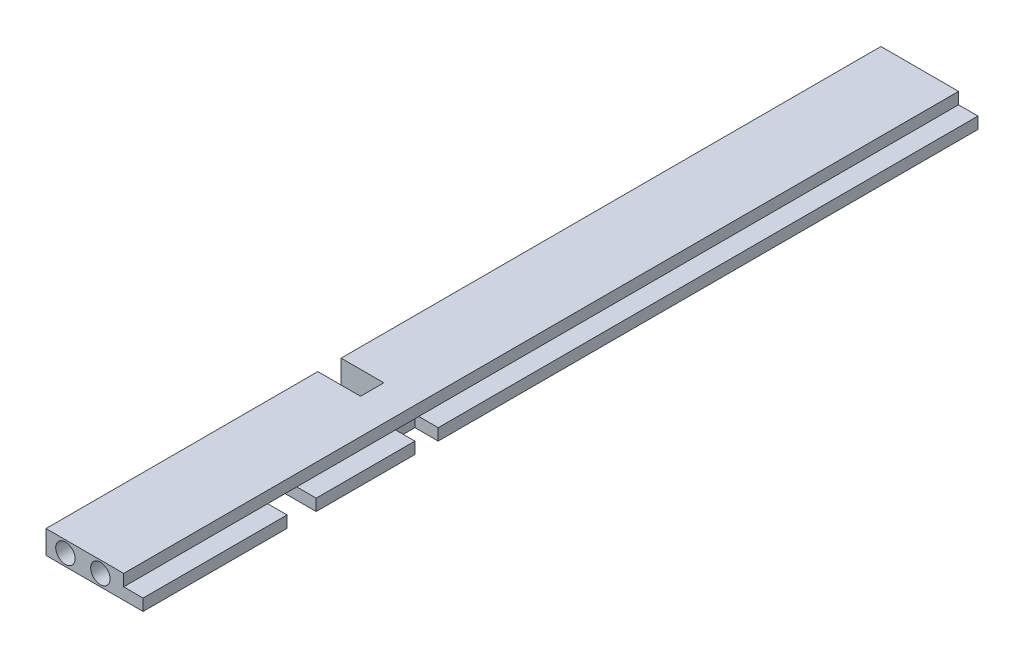
ISO-10303-21;
HEADER;
FILE_DESCRIPTION(('STEP AP214'),'2;1');
FILE_NAME('part.step','',(''),(''),'','','');
FILE_SCHEMA(('AUTOMOTIVE_DESIGN { 1 0 10303 214 1 1 1 1 }'));
ENDSEC;
DATA;
#1=APPLICATION_CONTEXT('core data for automotive mechanical design processes');
#2=APPLICATION_PROTOCOL_DEFINITION('international standard','automotive_design',2000,#1);
#3=PRODUCT_CONTEXT('',#1,'mechanical');
#4=PRODUCT('Part','Part','',(#3));
#5=PRODUCT_RELATED_PRODUCT_CATEGORY('part','',(#4));
#6=PRODUCT_DEFINITION_FORMATION('','',#4);
#7=PRODUCT_DEFINITION_CONTEXT('part definition',#1,'design');
#8=PRODUCT_DEFINITION('design','',#6,#7);
#9=PRODUCT_DEFINITION_SHAPE('','',#8);
#10=(LENGTH_UNIT() NAMED_UNIT(*) SI_UNIT(.MILLI.,.METRE.));
#11=(NAMED_UNIT(*) PLANE_ANGLE_UNIT() SI_UNIT($,.RADIAN.));
#12=(NAMED_UNIT(*) SI_UNIT($,.STERADIAN.) SOLID_ANGLE_UNIT());
#13=UNCERTAINTY_MEASURE_WITH_UNIT(LENGTH_MEASURE(1.E-05),#10,'distance_accuracy_value','');
#14=(GEOMETRIC_REPRESENTATION_CONTEXT(3) GLOBAL_UNCERTAINTY_ASSIGNED_CONTEXT((#13)) GLOBAL_UNIT_ASSIGNED_CONTEXT((#10,
#11,#12)) REPRESENTATION_CONTEXT('',''));
#15=CARTESIAN_POINT('',(0.,0.,0.));
#16=DIRECTION('',(0.,0.,1.));
#17=DIRECTION('',(1.,0.,0.));
#18=AXIS2_PLACEMENT_3D('',#15,#16,#17);
#19=CARTESIAN_POINT('',(25.,3.,215.));
#20=DIRECTION('',(-1.,0.,0.));
#21=DIRECTION('',(0.,0.,1.));
#22=AXIS2_PLACEMENT_3D('',#19,#20,#21);
#23=PLANE('',#22);
#24=DIRECTION('',(0.,0.,-1.));
#25=VECTOR('',#24,1.);
#26=CARTESIAN_POINT('',(25.,3.,215.));
#27=LINE('',#26,#25);
#28=CARTESIAN_POINT('',(25.,3.,139.));
#29=VERTEX_POINT('',#28);
#30=CARTESIAN_POINT('',(25.,3.,0.));
#31=VERTEX_POINT('',#30);
#32=EDGE_CURVE('E227',#29,#31,#27,.T.);
#33=ORIENTED_EDGE('',*,*,#32,.F.);
#34=DIRECTION('',(0.,-1.,0.));
#35=VECTOR('',#34,1.);
#36=CARTESIAN_POINT('',(25.,3.,139.));
#37=LINE('',#36,#35);
#38=CARTESIAN_POINT('',(25.,0.,139.));
#39=VERTEX_POINT('',#38);
#40=EDGE_CURVE('E348',#29,#39,#37,.T.);
#41=ORIENTED_EDGE('',*,*,#40,.T.);
#42=DIRECTION('',(0.,0.,-1.));
#43=VECTOR('',#42,1.);
#44=CARTESIAN_POINT('',(25.,0.,215.));
#45=LINE('',#44,#43);
#46=CARTESIAN_POINT('',(25.,0.,0.));
#47=VERTEX_POINT('',#46);
#48=EDGE_CURVE('E45',#39,#47,#45,.T.);
#49=ORIENTED_EDGE('',*,*,#48,.T.);
#50=DIRECTION('',(0.,1.,0.));
#51=VECTOR('',#50,1.);
#52=CARTESIAN_POINT('',(25.,3.,0.));
#53=LINE('',#52,#51);
#54=EDGE_CURVE('E259',#47,#31,#53,.T.);
#55=ORIENTED_EDGE('',*,*,#54,.T.);
#56=EDGE_LOOP('',(#33,#41,#49,#55));
#57=FACE_BOUND('',#56,.T.);
#58=ADVANCED_FACE('F36',(#57),#23,.F.);
#59=CARTESIAN_POINT('',(20.,3.,215.));
#60=DIRECTION('',(0.,-1.,0.));
#61=DIRECTION('',(1.,0.,0.));
#62=AXIS2_PLACEMENT_3D('',#59,#60,#61);
#63=PLANE('',#62);
#64=DIRECTION('',(0.,0.,-1.));
#65=VECTOR('',#64,1.);
#66=CARTESIAN_POINT('',(20.,3.,215.));
#67=LINE('',#66,#65);
#68=CARTESIAN_POINT('',(20.,3.,139.));
#69=VERTEX_POINT('',#68);
#70=CARTESIAN_POINT('',(20.,3.,0.));
#71=VERTEX_POINT('',#70);
#72=EDGE_CURVE('E234',#69,#71,#67,.T.);
#73=ORIENTED_EDGE('',*,*,#72,.F.);
#74=DIRECTION('',(1.,0.,0.));
#75=VECTOR('',#74,1.);
#76=CARTESIAN_POINT('',(25.,3.,139.));
#77=LINE('',#76,#75);
#78=EDGE_CURVE('E369',#69,#29,#77,.T.);
#79=ORIENTED_EDGE('',*,*,#78,.T.);
#80=ORIENTED_EDGE('',*,*,#32,.T.);
#81=DIRECTION('',(-1.,0.,0.));
#82=VECTOR('',#81,1.);
#83=CARTESIAN_POINT('',(20.,3.,0.));
#84=LINE('',#83,#82);
#85=EDGE_CURVE('E256',#31,#71,#84,.T.);
#86=ORIENTED_EDGE('',*,*,#85,.T.);
#87=EDGE_LOOP('',(#73,#79,#80,#86));
#88=FACE_BOUND('',#87,.T.);
#89=ADVANCED_FACE('F484',(#88),#63,.F.);
#90=CARTESIAN_POINT('',(0.,0.,215.));
#91=DIRECTION('',(1.,0.,0.));
#92=DIRECTION('',(0.,0.,-1.));
#93=AXIS2_PLACEMENT_3D('',#90,#91,#92);
#94=PLANE('',#93);
#95=DIRECTION('',(0.,0.,-1.));
#96=VECTOR('',#95,1.);
#97=CARTESIAN_POINT('',(0.,6.,215.));
#98=LINE('',#97,#96);
#99=CARTESIAN_POINT('',(0.,6.,215.));
#100=VERTEX_POINT('',#99);
#101=CARTESIAN_POINT('',(0.,6.,145.));
#102=VERTEX_POINT('',#101);
#103=EDGE_CURVE('E238',#100,#102,#98,.T.);
#104=ORIENTED_EDGE('',*,*,#103,.T.);
#105=DIRECTION('',(0.,-1.,0.));
#106=VECTOR('',#105,1.);
#107=CARTESIAN_POINT('',(0.,6.,145.));
#108=LINE('',#107,#106);
#109=CARTESIAN_POINT('',(0.,0.,145.));
#110=VERTEX_POINT('',#109);
#111=EDGE_CURVE('E321',#102,#110,#108,.T.);
#112=ORIENTED_EDGE('',*,*,#111,.T.);
#113=DIRECTION('',(0.,0.,-1.));
#114=VECTOR('',#113,1.);
#115=CARTESIAN_POINT('',(0.,0.,215.));
#116=LINE('',#115,#114);
#117=CARTESIAN_POINT('',(0.,0.,170.424574214991));
#118=VERTEX_POINT('',#117);
#119=EDGE_CURVE('E245',#118,#110,#116,.T.);
#120=ORIENTED_EDGE('',*,*,#119,.F.);
#121=DIRECTION('',(0.,-1.,0.));
#122=VECTOR('',#121,1.);
#123=CARTESIAN_POINT('',(0.,3.,170.424574214991));
#124=LINE('',#123,#122);
#125=CARTESIAN_POINT('',(0.,3.,170.424574214991));
#126=VERTEX_POINT('',#125);
#127=EDGE_CURVE('E303',#126,#118,#124,.T.);
#128=ORIENTED_EDGE('',*,*,#127,.F.);
#129=DIRECTION('',(0.,0.,-1.));
#130=VECTOR('',#129,1.);
#131=CARTESIAN_POINT('',(0.,3.,170.424574214991));
#132=LINE('',#131,#130);
#133=CARTESIAN_POINT('',(0.,3.,177.924574214991));
#134=VERTEX_POINT('',#133);
#135=EDGE_CURVE('E314',#134,#126,#132,.T.);
#136=ORIENTED_EDGE('',*,*,#135,.F.);
#137=DIRECTION('',(0.,-1.,0.));
#138=VECTOR('',#137,1.);
#139=CARTESIAN_POINT('',(0.,3.,177.924574214991));
#140=LINE('',#139,#138);
#141=CARTESIAN_POINT('',(0.,0.,177.924574214991));
#142=VERTEX_POINT('',#141);
#143=EDGE_CURVE('E295',#134,#142,#140,.T.);
#144=ORIENTED_EDGE('',*,*,#143,.T.);
#145=CARTESIAN_POINT('',(0.,0.,215.));
#146=VERTEX_POINT('',#145);
#147=EDGE_CURVE('E242',#146,#142,#116,.T.);
#148=ORIENTED_EDGE('',*,*,#147,.F.);
#149=DIRECTION('',(0.,-1.,0.));
#150=VECTOR('',#149,1.);
#151=CARTESIAN_POINT('',(0.,0.,215.));
#152=LINE('',#151,#150);
#153=EDGE_CURVE('E266',#100,#146,#152,.T.);
#154=ORIENTED_EDGE('',*,*,#153,.F.);
#155=EDGE_LOOP('',(#104,#112,#120,#128,#136,#144,#148,#154));
#156=FACE_BOUND('',#155,.T.);
#157=ADVANCED_FACE('F428',(#156),#94,.F.);
#158=CARTESIAN_POINT('',(25.,0.,170.424574214991));
#159=VERTEX_POINT('',#158);
#160=CARTESIAN_POINT('',(25.,0.,145.));
#161=VERTEX_POINT('',#160);
#162=EDGE_CURVE('E44',#159,#161,#45,.T.);
#163=ORIENTED_EDGE('',*,*,#162,.T.);
#164=DIRECTION('',(0.,-1.,0.));
#165=VECTOR('',#164,1.);
#166=CARTESIAN_POINT('',(25.,3.,145.));
#167=LINE('',#166,#165);
#168=CARTESIAN_POINT('',(25.,3.,145.));
#169=VERTEX_POINT('',#168);
#170=EDGE_CURVE('E203',#169,#161,#167,.T.);
#171=ORIENTED_EDGE('',*,*,#170,.F.);
#172=CARTESIAN_POINT('',(25.,3.,170.424574214991));
#173=VERTEX_POINT('',#172);
#174=EDGE_CURVE('E218',#173,#169,#27,.T.);
#175=ORIENTED_EDGE('',*,*,#174,.F.);
#176=DIRECTION('',(0.,-1.,0.));
#177=VECTOR('',#176,1.);
#178=CARTESIAN_POINT('',(25.,3.,170.424574214991));
#179=LINE('',#178,#177);
#180=EDGE_CURVE('E265',#173,#159,#179,.T.);
#181=ORIENTED_EDGE('',*,*,#180,.T.);
#182=EDGE_LOOP('',(#163,#171,#175,#181));
#183=FACE_BOUND('',#182,.T.);
#184=ADVANCED_FACE('F216',(#183),#23,.F.);
#185=ORIENTED_EDGE('',*,*,#174,.T.);
#186=DIRECTION('',(-1.,0.,0.));
#187=VECTOR('',#186,1.);
#188=CARTESIAN_POINT('',(25.,3.,145.));
#189=LINE('',#188,#187);
#190=CARTESIAN_POINT('',(20.,3.,145.));
#191=VERTEX_POINT('',#190);
#192=EDGE_CURVE('E199',#169,#191,#189,.T.);
#193=ORIENTED_EDGE('',*,*,#192,.T.);
#194=CARTESIAN_POINT('',(20.,3.,170.424574214991));
#195=VERTEX_POINT('',#194);
#196=EDGE_CURVE('E479',#195,#191,#67,.T.);
#197=ORIENTED_EDGE('',*,*,#196,.F.);
#198=DIRECTION('',(1.,0.,0.));
#199=VECTOR('',#198,1.);
#200=CARTESIAN_POINT('',(25.,3.,170.424574214991));
#201=LINE('',#200,#199);
#202=EDGE_CURVE('E225',#195,#173,#201,.T.);
#203=ORIENTED_EDGE('',*,*,#202,.T.);
#204=EDGE_LOOP('',(#185,#193,#197,#203));
#205=FACE_BOUND('',#204,.T.);
#206=ADVANCED_FACE('F223',(#205),#63,.F.);
#207=CARTESIAN_POINT('',(25.,0.,215.));
#208=DIRECTION('',(0.,1.,0.));
#209=DIRECTION('',(-1.,0.,0.));
#210=AXIS2_PLACEMENT_3D('',#207,#208,#209);
#211=PLANE('',#210);
#212=ORIENTED_EDGE('',*,*,#48,.F.);
#213=DIRECTION('',(1.,0.,0.));
#214=VECTOR('',#213,1.);
#215=CARTESIAN_POINT('',(25.,0.,139.));
#216=LINE('',#215,#214);
#217=CARTESIAN_POINT('',(19.,0.,139.));
#218=VERTEX_POINT('',#217);
#219=EDGE_CURVE('E360',#218,#39,#216,.T.);
#220=ORIENTED_EDGE('',*,*,#219,.F.);
#221=DIRECTION('',(0.,0.,-1.));
#222=VECTOR('',#221,1.);
#223=CARTESIAN_POINT('',(19.,0.,139.));
#224=LINE('',#223,#222);
#225=CARTESIAN_POINT('',(19.,0.,145.));
#226=VERTEX_POINT('',#225);
#227=EDGE_CURVE('E362',#226,#218,#224,.T.);
#228=ORIENTED_EDGE('',*,*,#227,.F.);
#229=DIRECTION('',(-1.,0.,0.));
#230=VECTOR('',#229,1.);
#231=CARTESIAN_POINT('',(25.,0.,145.));
#232=LINE('',#231,#230);
#233=EDGE_CURVE('E365',#161,#226,#232,.T.);
#234=ORIENTED_EDGE('',*,*,#233,.F.);
#235=ORIENTED_EDGE('',*,*,#162,.F.);
#236=DIRECTION('',(1.,0.,0.));
#237=VECTOR('',#236,1.);
#238=CARTESIAN_POINT('',(25.,0.,170.424574214991));
#239=LINE('',#238,#237);
#240=CARTESIAN_POINT('',(17.,0.,170.424574214991));
#241=VERTEX_POINT('',#240);
#242=EDGE_CURVE('E286',#241,#159,#239,.T.);
#243=ORIENTED_EDGE('',*,*,#242,.F.);
#244=DIRECTION('',(0.,0.,-1.));
#245=VECTOR('',#244,1.);
#246=CARTESIAN_POINT('',(17.,0.,170.424574214991));
#247=LINE('',#246,#245);
#248=CARTESIAN_POINT('',(17.,0.,177.924574214991));
#249=VERTEX_POINT('',#248);
#250=EDGE_CURVE('E289',#249,#241,#247,.T.);
#251=ORIENTED_EDGE('',*,*,#250,.F.);
#252=DIRECTION('',(-1.,0.,0.));
#253=VECTOR('',#252,1.);
#254=CARTESIAN_POINT('',(25.,0.,177.924574214991));
#255=LINE('',#254,#253);
#256=CARTESIAN_POINT('',(25.,0.,177.924574214991));
#257=VERTEX_POINT('',#256);
#258=EDGE_CURVE('E292',#257,#249,#255,.T.);
#259=ORIENTED_EDGE('',*,*,#258,.F.);
#260=CARTESIAN_POINT('',(25.,0.,215.));
#261=VERTEX_POINT('',#260);
#262=EDGE_CURVE('E11',#261,#257,#45,.T.);
#263=ORIENTED_EDGE('',*,*,#262,.F.);
#264=DIRECTION('',(1.,0.,0.));
#265=VECTOR('',#264,1.);
#266=CARTESIAN_POINT('',(25.,0.,215.));
#267=LINE('',#266,#265);
#268=EDGE_CURVE('E250',#146,#261,#267,.T.);
#269=ORIENTED_EDGE('',*,*,#268,.F.);
#270=ORIENTED_EDGE('',*,*,#147,.T.);
#271=DIRECTION('',(-1.,0.,0.));
#272=VECTOR('',#271,1.);
#273=CARTESIAN_POINT('',(0.,0.,177.924574214991));
#274=LINE('',#273,#272);
#275=CARTESIAN_POINT('',(11.,0.,177.924574214991));
#276=VERTEX_POINT('',#275);
#277=EDGE_CURVE('E312',#276,#142,#274,.T.);
#278=ORIENTED_EDGE('',*,*,#277,.F.);
#279=DIRECTION('',(0.,0.,1.));
#280=VECTOR('',#279,1.);
#281=CARTESIAN_POINT('',(11.,0.,170.424574214991));
#282=LINE('',#281,#280);
#283=CARTESIAN_POINT('',(11.,0.,170.424574214991));
#284=VERTEX_POINT('',#283);
#285=EDGE_CURVE('E315',#284,#276,#282,.T.);
#286=ORIENTED_EDGE('',*,*,#285,.F.);
#287=DIRECTION('',(1.,0.,0.));
#288=VECTOR('',#287,1.);
#289=CARTESIAN_POINT('',(0.,0.,170.424574214991));
#290=LINE('',#289,#288);
#291=EDGE_CURVE('E318',#118,#284,#290,.T.);
#292=ORIENTED_EDGE('',*,*,#291,.F.);
#293=ORIENTED_EDGE('',*,*,#119,.T.);
#294=DIRECTION('',(-1.,0.,0.));
#295=VECTOR('',#294,1.);
#296=CARTESIAN_POINT('',(0.,0.,145.));
#297=LINE('',#296,#295);
#298=CARTESIAN_POINT('',(11.,0.,145.));
#299=VERTEX_POINT('',#298);
#300=EDGE_CURVE('E340',#299,#110,#297,.T.);
#301=ORIENTED_EDGE('',*,*,#300,.F.);
#302=DIRECTION('',(0.,0.,1.));
#303=VECTOR('',#302,1.);
#304=CARTESIAN_POINT('',(11.,0.,139.));
#305=LINE('',#304,#303);
#306=CARTESIAN_POINT('',(11.,0.,139.));
#307=VERTEX_POINT('',#306);
#308=EDGE_CURVE('E342',#307,#299,#305,.T.);
#309=ORIENTED_EDGE('',*,*,#308,.F.);
#310=DIRECTION('',(1.,0.,0.));
#311=VECTOR('',#310,1.);
#312=CARTESIAN_POINT('',(0.,0.,139.));
#313=LINE('',#312,#311);
#314=CARTESIAN_POINT('',(0.,0.,139.));
#315=VERTEX_POINT('',#314);
#316=EDGE_CURVE('E345',#315,#307,#313,.T.);
#317=ORIENTED_EDGE('',*,*,#316,.F.);
#318=CARTESIAN_POINT('',(0.,0.,0.));
#319=VERTEX_POINT('',#318);
#320=EDGE_CURVE('E246',#315,#319,#116,.T.);
#321=ORIENTED_EDGE('',*,*,#320,.T.);
#322=DIRECTION('',(1.,0.,0.));
#323=VECTOR('',#322,1.);
#324=CARTESIAN_POINT('',(25.,0.,0.));
#325=LINE('',#324,#323);
#326=EDGE_CURVE('E262',#319,#47,#325,.T.);
#327=ORIENTED_EDGE('',*,*,#326,.T.);
#328=EDGE_LOOP('',(#212,#220,#228,#234,#235,#243,#251,#259,#263,#269,#270,#278,#286,#292,#293,
#301,#309,#317,#321,#327));
#329=FACE_BOUND('',#328,.T.);
#330=ADVANCED_FACE('F38',(#329),#211,.F.);
#331=ORIENTED_EDGE('',*,*,#262,.T.);
#332=DIRECTION('',(0.,-1.,0.));
#333=VECTOR('',#332,1.);
#334=CARTESIAN_POINT('',(25.,3.,177.924574214991));
#335=LINE('',#334,#333);
#336=CARTESIAN_POINT('',(25.,3.,177.924574214991));
#337=VERTEX_POINT('',#336);
#338=EDGE_CURVE('E278',#337,#257,#335,.T.);
#339=ORIENTED_EDGE('',*,*,#338,.F.);
#340=CARTESIAN_POINT('',(25.,3.,215.));
#341=VERTEX_POINT('',#340);
#342=EDGE_CURVE('E226',#341,#337,#27,.T.);
#343=ORIENTED_EDGE('',*,*,#342,.F.);
#344=DIRECTION('',(0.,1.,0.));
#345=VECTOR('',#344,1.);
#346=CARTESIAN_POINT('',(25.,3.,215.));
#347=LINE('',#346,#345);
#348=EDGE_CURVE('E274',#261,#341,#347,.T.);
#349=ORIENTED_EDGE('',*,*,#348,.F.);
#350=EDGE_LOOP('',(#331,#339,#343,#349));
#351=FACE_BOUND('',#350,.T.);
#352=ADVANCED_FACE('F411',(#351),#23,.F.);
#353=ORIENTED_EDGE('',*,*,#342,.T.);
#354=DIRECTION('',(-1.,0.,0.));
#355=VECTOR('',#354,1.);
#356=CARTESIAN_POINT('',(25.,3.,177.924574214991));
#357=LINE('',#356,#355);
#358=CARTESIAN_POINT('',(20.,3.,177.924574214991));
#359=VERTEX_POINT('',#358);
#360=EDGE_CURVE('E300',#337,#359,#357,.T.);
#361=ORIENTED_EDGE('',*,*,#360,.T.);
#362=CARTESIAN_POINT('',(20.,3.,215.));
#363=VERTEX_POINT('',#362);
#364=EDGE_CURVE('E229',#363,#359,#67,.T.);
#365=ORIENTED_EDGE('',*,*,#364,.F.);
#366=DIRECTION('',(-1.,0.,0.));
#367=VECTOR('',#366,1.);
#368=CARTESIAN_POINT('',(20.,3.,215.));
#369=LINE('',#368,#367);
#370=EDGE_CURVE('E272',#341,#363,#369,.T.);
#371=ORIENTED_EDGE('',*,*,#370,.F.);
#372=EDGE_LOOP('',(#353,#361,#365,#371));
#373=FACE_BOUND('',#372,.T.);
#374=ADVANCED_FACE('F415',(#373),#63,.F.);
#375=CARTESIAN_POINT('',(20.,6.,215.));
#376=DIRECTION('',(-1.,0.,0.));
#377=DIRECTION('',(0.,0.,1.));
#378=AXIS2_PLACEMENT_3D('',#375,#376,#377);
#379=PLANE('',#378);
#380=DIRECTION('',(0.,1.,0.));
#381=VECTOR('',#380,1.);
#382=CARTESIAN_POINT('',(20.,6.,0.));
#383=LINE('',#382,#381);
#384=CARTESIAN_POINT('',(20.,6.,0.));
#385=VERTEX_POINT('',#384);
#386=EDGE_CURVE('E254',#71,#385,#383,.T.);
#387=ORIENTED_EDGE('',*,*,#386,.T.);
#388=DIRECTION('',(0.,0.,-1.));
#389=VECTOR('',#388,1.);
#390=CARTESIAN_POINT('',(20.,6.,215.));
#391=LINE('',#390,#389);
#392=CARTESIAN_POINT('',(20.,6.,215.));
#393=VERTEX_POINT('',#392);
#394=EDGE_CURVE('E235',#393,#385,#391,.T.);
#395=ORIENTED_EDGE('',*,*,#394,.F.);
#396=DIRECTION('',(0.,1.,0.));
#397=VECTOR('',#396,1.);
#398=CARTESIAN_POINT('',(20.,6.,215.));
#399=LINE('',#398,#397);
#400=EDGE_CURVE('E270',#363,#393,#399,.T.);
#401=ORIENTED_EDGE('',*,*,#400,.F.);
#402=ORIENTED_EDGE('',*,*,#364,.T.);
#403=EDGE_CURVE('E233',#359,#195,#67,.T.);
#404=ORIENTED_EDGE('',*,*,#403,.T.);
#405=ORIENTED_EDGE('',*,*,#196,.T.);
#406=EDGE_CURVE('E481',#191,#69,#67,.T.);
#407=ORIENTED_EDGE('',*,*,#406,.T.);
#408=ORIENTED_EDGE('',*,*,#72,.T.);
#409=EDGE_LOOP('',(#387,#395,#401,#402,#404,#405,#407,#408));
#410=FACE_BOUND('',#409,.T.);
#411=ADVANCED_FACE('F421',(#410),#379,.F.);
#412=CARTESIAN_POINT('',(0.,6.,215.));
#413=DIRECTION('',(0.,-1.,0.));
#414=DIRECTION('',(0.,0.,-1.));
#415=AXIS2_PLACEMENT_3D('',#412,#413,#414);
#416=PLANE('',#415);
#417=DIRECTION('',(0.,0.,1.));
#418=VECTOR('',#417,1.);
#419=CARTESIAN_POINT('',(11.,6.,139.));
#420=LINE('',#419,#418);
#421=CARTESIAN_POINT('',(11.,6.,139.));
#422=VERTEX_POINT('',#421);
#423=CARTESIAN_POINT('',(11.,6.,145.));
#424=VERTEX_POINT('',#423);
#425=EDGE_CURVE('E351',#422,#424,#420,.T.);
#426=ORIENTED_EDGE('',*,*,#425,.T.);
#427=DIRECTION('',(-1.,0.,0.));
#428=VECTOR('',#427,1.);
#429=CARTESIAN_POINT('',(0.,6.,145.));
#430=LINE('',#429,#428);
#431=EDGE_CURVE('E334',#424,#102,#430,.T.);
#432=ORIENTED_EDGE('',*,*,#431,.T.);
#433=ORIENTED_EDGE('',*,*,#103,.F.);
#434=DIRECTION('',(-1.,0.,0.));
#435=VECTOR('',#434,1.);
#436=CARTESIAN_POINT('',(0.,6.,215.));
#437=LINE('',#436,#435);
#438=EDGE_CURVE('E268',#393,#100,#437,.T.);
#439=ORIENTED_EDGE('',*,*,#438,.F.);
#440=ORIENTED_EDGE('',*,*,#394,.T.);
#441=DIRECTION('',(-1.,0.,0.));
#442=VECTOR('',#441,1.);
#443=CARTESIAN_POINT('',(0.,6.,0.));
#444=LINE('',#443,#442);
#445=CARTESIAN_POINT('',(0.,6.,0.));
#446=VERTEX_POINT('',#445);
#447=EDGE_CURVE('E251',#385,#446,#444,.T.);
#448=ORIENTED_EDGE('',*,*,#447,.T.);
#449=CARTESIAN_POINT('',(0.,6.,139.));
#450=VERTEX_POINT('',#449);
#451=EDGE_CURVE('E241',#450,#446,#98,.T.);
#452=ORIENTED_EDGE('',*,*,#451,.F.);
#453=DIRECTION('',(1.,0.,0.));
#454=VECTOR('',#453,1.);
#455=CARTESIAN_POINT('',(0.,6.,139.));
#456=LINE('',#455,#454);
#457=EDGE_CURVE('E60',#450,#422,#456,.T.);
#458=ORIENTED_EDGE('',*,*,#457,.T.);
#459=EDGE_LOOP('',(#426,#432,#433,#439,#440,#448,#452,#458));
#460=FACE_BOUND('',#459,.T.);
#461=ADVANCED_FACE('F425',(#460),#416,.F.);
#462=ORIENTED_EDGE('',*,*,#320,.F.);
#463=DIRECTION('',(0.,-1.,0.));
#464=VECTOR('',#463,1.);
#465=CARTESIAN_POINT('',(0.,6.,139.));
#466=LINE('',#465,#464);
#467=EDGE_CURVE('E331',#450,#315,#466,.T.);
#468=ORIENTED_EDGE('',*,*,#467,.F.);
#469=ORIENTED_EDGE('',*,*,#451,.T.);
#470=DIRECTION('',(0.,-1.,0.));
#471=VECTOR('',#470,1.);
#472=CARTESIAN_POINT('',(0.,0.,0.));
#473=LINE('',#472,#471);
#474=EDGE_CURVE('E247',#446,#319,#473,.T.);
#475=ORIENTED_EDGE('',*,*,#474,.T.);
#476=EDGE_LOOP('',(#462,#468,#469,#475));
#477=FACE_BOUND('',#476,.T.);
#478=ADVANCED_FACE('F396',(#477),#94,.F.);
#479=CARTESIAN_POINT('',(0.,0.,215.));
#480=DIRECTION('',(0.,0.,-1.));
#481=DIRECTION('',(-1.,0.,0.));
#482=AXIS2_PLACEMENT_3D('',#479,#480,#481);
#483=PLANE('',#482);
#484=CARTESIAN_POINT('',(14.,3.,215.));
#485=DIRECTION('',(0.,0.,1.));
#486=DIRECTION('',(1.,0.,0.));
#487=AXIS2_PLACEMENT_3D('',#484,#485,#486);
#488=CIRCLE('',#487,2.5);
#489=CARTESIAN_POINT('',(16.5,3.,215.));
#490=VERTEX_POINT('',#489);
#491=EDGE_CURVE('E377',#490,#490,#488,.T.);
#492=ORIENTED_EDGE('',*,*,#491,.F.);
#493=EDGE_LOOP('',(#492));
#494=FACE_BOUND('',#493,.T.);
#495=CARTESIAN_POINT('',(5.,3.,215.));
#496=DIRECTION('',(0.,0.,1.));
#497=DIRECTION('',(1.,0.,0.));
#498=AXIS2_PLACEMENT_3D('',#495,#496,#497);
#499=CIRCLE('',#498,2.5);
#500=CARTESIAN_POINT('',(7.5,3.,215.));
#501=VERTEX_POINT('',#500);
#502=EDGE_CURVE('E371',#501,#501,#499,.T.);
#503=ORIENTED_EDGE('',*,*,#502,.F.);
#504=EDGE_LOOP('',(#503));
#505=FACE_BOUND('',#504,.T.);
#506=ORIENTED_EDGE('',*,*,#268,.T.);
#507=ORIENTED_EDGE('',*,*,#348,.T.);
#508=ORIENTED_EDGE('',*,*,#370,.T.);
#509=ORIENTED_EDGE('',*,*,#400,.T.);
#510=ORIENTED_EDGE('',*,*,#438,.T.);
#511=ORIENTED_EDGE('',*,*,#153,.T.);
#512=EDGE_LOOP('',(#506,#507,#508,#509,#510,#511));
#513=FACE_BOUND('',#512,.T.);
#514=ADVANCED_FACE('F392',(#494,#505,#513),#483,.F.);
#515=CARTESIAN_POINT('',(0.,0.,0.));
#516=DIRECTION('',(0.,0.,-1.));
#517=DIRECTION('',(-1.,0.,0.));
#518=AXIS2_PLACEMENT_3D('',#515,#516,#517);
#519=PLANE('',#518);
#520=ORIENTED_EDGE('',*,*,#326,.F.);
#521=ORIENTED_EDGE('',*,*,#474,.F.);
#522=ORIENTED_EDGE('',*,*,#447,.F.);
#523=ORIENTED_EDGE('',*,*,#386,.F.);
#524=ORIENTED_EDGE('',*,*,#85,.F.);
#525=ORIENTED_EDGE('',*,*,#54,.F.);
#526=EDGE_LOOP('',(#520,#521,#522,#523,#524,#525));
#527=FACE_BOUND('',#526,.T.);
#528=ADVANCED_FACE('F395',(#527),#519,.T.);
#529=CARTESIAN_POINT('',(0.,3.,0.));
#530=DIRECTION('',(0.,-1.,0.));
#531=DIRECTION('',(1.,0.,0.));
#532=AXIS2_PLACEMENT_3D('',#529,#530,#531);
#533=PLANE('',#532);
#534=ORIENTED_EDGE('',*,*,#403,.F.);
#535=CARTESIAN_POINT('',(17.,3.,177.924574214991));
#536=VERTEX_POINT('',#535);
#537=EDGE_CURVE('E288',#359,#536,#357,.T.);
#538=ORIENTED_EDGE('',*,*,#537,.T.);
#539=DIRECTION('',(0.,0.,-1.));
#540=VECTOR('',#539,1.);
#541=CARTESIAN_POINT('',(17.,3.,170.424574214991));
#542=LINE('',#541,#540);
#543=CARTESIAN_POINT('',(17.,3.,170.424574214991));
#544=VERTEX_POINT('',#543);
#545=EDGE_CURVE('E297',#536,#544,#542,.T.);
#546=ORIENTED_EDGE('',*,*,#545,.T.);
#547=EDGE_CURVE('E281',#544,#195,#201,.T.);
#548=ORIENTED_EDGE('',*,*,#547,.T.);
#549=EDGE_LOOP('',(#534,#538,#546,#548));
#550=FACE_BOUND('',#549,.T.);
#551=ADVANCED_FACE('F526',(#550),#533,.T.);
#552=CARTESIAN_POINT('',(25.,3.,170.424574214991));
#553=DIRECTION('',(0.,0.,-1.));
#554=DIRECTION('',(-1.,0.,0.));
#555=AXIS2_PLACEMENT_3D('',#552,#553,#554);
#556=PLANE('',#555);
#557=ORIENTED_EDGE('',*,*,#242,.T.);
#558=ORIENTED_EDGE('',*,*,#180,.F.);
#559=ORIENTED_EDGE('',*,*,#202,.F.);
#560=ORIENTED_EDGE('',*,*,#547,.F.);
#561=DIRECTION('',(0.,-1.,0.));
#562=VECTOR('',#561,1.);
#563=CARTESIAN_POINT('',(17.,3.,170.424574214991));
#564=LINE('',#563,#562);
#565=EDGE_CURVE('E283',#544,#241,#564,.T.);
#566=ORIENTED_EDGE('',*,*,#565,.T.);
#567=EDGE_LOOP('',(#557,#558,#559,#560,#566));
#568=FACE_BOUND('',#567,.T.);
#569=ADVANCED_FACE('F468',(#568),#556,.F.);
#570=CARTESIAN_POINT('',(17.,3.,170.424574214991));
#571=DIRECTION('',(-1.,0.,0.));
#572=DIRECTION('',(0.,-1.,0.));
#573=AXIS2_PLACEMENT_3D('',#570,#571,#572);
#574=PLANE('',#573);
#575=ORIENTED_EDGE('',*,*,#250,.T.);
#576=ORIENTED_EDGE('',*,*,#565,.F.);
#577=ORIENTED_EDGE('',*,*,#545,.F.);
#578=DIRECTION('',(0.,-1.,0.));
#579=VECTOR('',#578,1.);
#580=CARTESIAN_POINT('',(17.,3.,177.924574214991));
#581=LINE('',#580,#579);
#582=EDGE_CURVE('E280',#536,#249,#581,.T.);
#583=ORIENTED_EDGE('',*,*,#582,.T.);
#584=EDGE_LOOP('',(#575,#576,#577,#583));
#585=FACE_BOUND('',#584,.T.);
#586=ADVANCED_FACE('F472',(#585),#574,.F.);
#587=CARTESIAN_POINT('',(25.,3.,177.924574214991));
#588=DIRECTION('',(0.,0.,1.));
#589=DIRECTION('',(1.,0.,0.));
#590=AXIS2_PLACEMENT_3D('',#587,#588,#589);
#591=PLANE('',#590);
#592=ORIENTED_EDGE('',*,*,#258,.T.);
#593=ORIENTED_EDGE('',*,*,#582,.F.);
#594=ORIENTED_EDGE('',*,*,#537,.F.);
#595=ORIENTED_EDGE('',*,*,#360,.F.);
#596=ORIENTED_EDGE('',*,*,#338,.T.);
#597=EDGE_LOOP('',(#592,#593,#594,#595,#596));
#598=FACE_BOUND('',#597,.T.);
#599=ADVANCED_FACE('F476',(#598),#591,.F.);
#600=CARTESIAN_POINT('',(0.,3.,177.924574214991));
#601=DIRECTION('',(0.,0.,1.));
#602=DIRECTION('',(1.,0.,0.));
#603=AXIS2_PLACEMENT_3D('',#600,#601,#602);
#604=PLANE('',#603);
#605=ORIENTED_EDGE('',*,*,#277,.T.);
#606=ORIENTED_EDGE('',*,*,#143,.F.);
#607=DIRECTION('',(-1.,0.,0.));
#608=VECTOR('',#607,1.);
#609=CARTESIAN_POINT('',(0.,3.,177.924574214991));
#610=LINE('',#609,#608);
#611=CARTESIAN_POINT('',(11.,3.,177.924574214991));
#612=VERTEX_POINT('',#611);
#613=EDGE_CURVE('E306',#612,#134,#610,.T.);
#614=ORIENTED_EDGE('',*,*,#613,.F.);
#615=DIRECTION('',(0.,-1.,0.));
#616=VECTOR('',#615,1.);
#617=CARTESIAN_POINT('',(11.,3.,177.924574214991));
#618=LINE('',#617,#616);
#619=EDGE_CURVE('E308',#612,#276,#618,.T.);
#620=ORIENTED_EDGE('',*,*,#619,.T.);
#621=EDGE_LOOP('',(#605,#606,#614,#620));
#622=FACE_BOUND('',#621,.T.);
#623=ADVANCED_FACE('F435',(#622),#604,.F.);
#624=CARTESIAN_POINT('',(11.,3.,170.424574214991));
#625=DIRECTION('',(1.,0.,0.));
#626=DIRECTION('',(0.,1.,0.));
#627=AXIS2_PLACEMENT_3D('',#624,#625,#626);
#628=PLANE('',#627);
#629=ORIENTED_EDGE('',*,*,#285,.T.);
#630=ORIENTED_EDGE('',*,*,#619,.F.);
#631=DIRECTION('',(0.,0.,1.));
#632=VECTOR('',#631,1.);
#633=CARTESIAN_POINT('',(11.,3.,170.424574214991));
#634=LINE('',#633,#632);
#635=CARTESIAN_POINT('',(11.,3.,170.424574214991));
#636=VERTEX_POINT('',#635);
#637=EDGE_CURVE('E323',#636,#612,#634,.T.);
#638=ORIENTED_EDGE('',*,*,#637,.F.);
#639=DIRECTION('',(0.,-1.,0.));
#640=VECTOR('',#639,1.);
#641=CARTESIAN_POINT('',(11.,3.,170.424574214991));
#642=LINE('',#641,#640);
#643=EDGE_CURVE('E305',#636,#284,#642,.T.);
#644=ORIENTED_EDGE('',*,*,#643,.T.);
#645=EDGE_LOOP('',(#629,#630,#638,#644));
#646=FACE_BOUND('',#645,.T.);
#647=ADVANCED_FACE('F439',(#646),#628,.F.);
#648=CARTESIAN_POINT('',(0.,3.,170.424574214991));
#649=DIRECTION('',(0.,0.,-1.));
#650=DIRECTION('',(-1.,0.,0.));
#651=AXIS2_PLACEMENT_3D('',#648,#649,#650);
#652=PLANE('',#651);
#653=ORIENTED_EDGE('',*,*,#291,.T.);
#654=ORIENTED_EDGE('',*,*,#643,.F.);
#655=DIRECTION('',(1.,0.,0.));
#656=VECTOR('',#655,1.);
#657=CARTESIAN_POINT('',(0.,3.,170.424574214991));
#658=LINE('',#657,#656);
#659=EDGE_CURVE('E326',#126,#636,#658,.T.);
#660=ORIENTED_EDGE('',*,*,#659,.F.);
#661=ORIENTED_EDGE('',*,*,#127,.T.);
#662=EDGE_LOOP('',(#653,#654,#660,#661));
#663=FACE_BOUND('',#662,.T.);
#664=ADVANCED_FACE('F441',(#663),#652,.F.);
#665=CARTESIAN_POINT('',(0.,3.,0.));
#666=DIRECTION('',(0.,1.,0.));
#667=DIRECTION('',(-1.,0.,0.));
#668=AXIS2_PLACEMENT_3D('',#665,#666,#667);
#669=PLANE('',#668);
#670=ORIENTED_EDGE('',*,*,#135,.T.);
#671=ORIENTED_EDGE('',*,*,#659,.T.);
#672=ORIENTED_EDGE('',*,*,#637,.T.);
#673=ORIENTED_EDGE('',*,*,#613,.T.);
#674=EDGE_LOOP('',(#670,#671,#672,#673));
#675=FACE_BOUND('',#674,.T.);
#676=ADVANCED_FACE('F491',(#675),#669,.F.);
#677=CARTESIAN_POINT('',(0.,6.,145.));
#678=DIRECTION('',(0.,0.,1.));
#679=DIRECTION('',(1.,0.,0.));
#680=AXIS2_PLACEMENT_3D('',#677,#678,#679);
#681=PLANE('',#680);
#682=ORIENTED_EDGE('',*,*,#300,.T.);
#683=ORIENTED_EDGE('',*,*,#111,.F.);
#684=ORIENTED_EDGE('',*,*,#431,.F.);
#685=DIRECTION('',(0.,-1.,0.));
#686=VECTOR('',#685,1.);
#687=CARTESIAN_POINT('',(11.,6.,145.));
#688=LINE('',#687,#686);
#689=EDGE_CURVE('E336',#424,#299,#688,.T.);
#690=ORIENTED_EDGE('',*,*,#689,.T.);
#691=EDGE_LOOP('',(#682,#683,#684,#690));
#692=FACE_BOUND('',#691,.T.);
#693=ADVANCED_FACE('F489',(#692),#681,.F.);
#694=CARTESIAN_POINT('',(11.,6.,139.));
#695=DIRECTION('',(1.,0.,0.));
#696=DIRECTION('',(0.,1.,0.));
#697=AXIS2_PLACEMENT_3D('',#694,#695,#696);
#698=PLANE('',#697);
#699=ORIENTED_EDGE('',*,*,#308,.T.);
#700=ORIENTED_EDGE('',*,*,#689,.F.);
#701=ORIENTED_EDGE('',*,*,#425,.F.);
#702=DIRECTION('',(0.,-1.,0.));
#703=VECTOR('',#702,1.);
#704=CARTESIAN_POINT('',(11.,6.,139.));
#705=LINE('',#704,#703);
#706=EDGE_CURVE('E333',#422,#307,#705,.T.);
#707=ORIENTED_EDGE('',*,*,#706,.T.);
#708=EDGE_LOOP('',(#699,#700,#701,#707));
#709=FACE_BOUND('',#708,.T.);
#710=ADVANCED_FACE('F487',(#709),#698,.F.);
#711=CARTESIAN_POINT('',(0.,6.,139.));
#712=DIRECTION('',(0.,0.,-1.));
#713=DIRECTION('',(-1.,0.,0.));
#714=AXIS2_PLACEMENT_3D('',#711,#712,#713);
#715=PLANE('',#714);
#716=ORIENTED_EDGE('',*,*,#316,.T.);
#717=ORIENTED_EDGE('',*,*,#706,.F.);
#718=ORIENTED_EDGE('',*,*,#457,.F.);
#719=ORIENTED_EDGE('',*,*,#467,.T.);
#720=EDGE_LOOP('',(#716,#717,#718,#719));
#721=FACE_BOUND('',#720,.T.);
#722=ADVANCED_FACE('F497',(#721),#715,.F.);
#723=CARTESIAN_POINT('',(0.,3.,0.));
#724=DIRECTION('',(0.,-1.,0.));
#725=DIRECTION('',(1.,0.,0.));
#726=AXIS2_PLACEMENT_3D('',#723,#724,#725);
#727=PLANE('',#726);
#728=ORIENTED_EDGE('',*,*,#406,.F.);
#729=CARTESIAN_POINT('',(19.,3.,145.));
#730=VERTEX_POINT('',#729);
#731=EDGE_CURVE('E206',#191,#730,#189,.T.);
#732=ORIENTED_EDGE('',*,*,#731,.T.);
#733=DIRECTION('',(0.,0.,-1.));
#734=VECTOR('',#733,1.);
#735=CARTESIAN_POINT('',(19.,3.,139.));
#736=LINE('',#735,#734);
#737=CARTESIAN_POINT('',(19.,3.,139.));
#738=VERTEX_POINT('',#737);
#739=EDGE_CURVE('E211',#730,#738,#736,.T.);
#740=ORIENTED_EDGE('',*,*,#739,.T.);
#741=EDGE_CURVE('E52',#738,#69,#77,.T.);
#742=ORIENTED_EDGE('',*,*,#741,.T.);
#743=EDGE_LOOP('',(#728,#732,#740,#742));
#744=FACE_BOUND('',#743,.T.);
#745=ADVANCED_FACE('F543',(#744),#727,.T.);
#746=CARTESIAN_POINT('',(25.,3.,139.));
#747=DIRECTION('',(0.,0.,-1.));
#748=DIRECTION('',(-1.,0.,0.));
#749=AXIS2_PLACEMENT_3D('',#746,#747,#748);
#750=PLANE('',#749);
#751=ORIENTED_EDGE('',*,*,#219,.T.);
#752=ORIENTED_EDGE('',*,*,#40,.F.);
#753=ORIENTED_EDGE('',*,*,#78,.F.);
#754=ORIENTED_EDGE('',*,*,#741,.F.);
#755=DIRECTION('',(0.,-1.,0.));
#756=VECTOR('',#755,1.);
#757=CARTESIAN_POINT('',(19.,3.,139.));
#758=LINE('',#757,#756);
#759=EDGE_CURVE('E356',#738,#218,#758,.T.);
#760=ORIENTED_EDGE('',*,*,#759,.T.);
#761=EDGE_LOOP('',(#751,#752,#753,#754,#760));
#762=FACE_BOUND('',#761,.T.);
#763=ADVANCED_FACE('F461',(#762),#750,.F.);
#764=CARTESIAN_POINT('',(19.,3.,139.));
#765=DIRECTION('',(-1.,0.,0.));
#766=DIRECTION('',(0.,-1.,0.));
#767=AXIS2_PLACEMENT_3D('',#764,#765,#766);
#768=PLANE('',#767);
#769=ORIENTED_EDGE('',*,*,#227,.T.);
#770=ORIENTED_EDGE('',*,*,#759,.F.);
#771=ORIENTED_EDGE('',*,*,#739,.F.);
#772=DIRECTION('',(0.,-1.,0.));
#773=VECTOR('',#772,1.);
#774=CARTESIAN_POINT('',(19.,3.,145.));
#775=LINE('',#774,#773);
#776=EDGE_CURVE('E220',#730,#226,#775,.T.);
#777=ORIENTED_EDGE('',*,*,#776,.T.);
#778=EDGE_LOOP('',(#769,#770,#771,#777));
#779=FACE_BOUND('',#778,.T.);
#780=ADVANCED_FACE('F465',(#779),#768,.F.);
#781=CARTESIAN_POINT('',(25.,3.,145.));
#782=DIRECTION('',(0.,0.,1.));
#783=DIRECTION('',(1.,0.,0.));
#784=AXIS2_PLACEMENT_3D('',#781,#782,#783);
#785=PLANE('',#784);
#786=ORIENTED_EDGE('',*,*,#233,.T.);
#787=ORIENTED_EDGE('',*,*,#776,.F.);
#788=ORIENTED_EDGE('',*,*,#731,.F.);
#789=ORIENTED_EDGE('',*,*,#192,.F.);
#790=ORIENTED_EDGE('',*,*,#170,.T.);
#791=EDGE_LOOP('',(#786,#787,#788,#789,#790));
#792=FACE_BOUND('',#791,.T.);
#793=ADVANCED_FACE('F202',(#792),#785,.F.);
#794=CARTESIAN_POINT('',(5.,3.,205.));
#795=DIRECTION('',(0.,0.,1.));
#796=DIRECTION('',(1.,0.,0.));
#797=AXIS2_PLACEMENT_3D('',#794,#795,#796);
#798=CYLINDRICAL_SURFACE('',#797,2.5);
#799=CARTESIAN_POINT('',(5.,3.,205.));
#800=DIRECTION('',(0.,0.,1.));
#801=DIRECTION('',(1.,0.,0.));
#802=AXIS2_PLACEMENT_3D('',#799,#800,#801);
#803=CIRCLE('',#802,2.5);
#804=CARTESIAN_POINT('',(7.5,3.,205.));
#805=VERTEX_POINT('',#804);
#806=EDGE_CURVE('E367',#805,#805,#803,.T.);
#807=ORIENTED_EDGE('',*,*,#806,.F.);
#808=EDGE_LOOP('',(#807));
#809=FACE_BOUND('',#808,.T.);
#810=ORIENTED_EDGE('',*,*,#502,.T.);
#811=EDGE_LOOP('',(#810));
#812=FACE_BOUND('',#811,.T.);
#813=ADVANCED_FACE('F553',(#809,#812),#798,.F.);
#814=CARTESIAN_POINT('',(5.,3.,205.));
#815=DIRECTION('',(0.,0.,1.));
#816=DIRECTION('',(1.,0.,0.));
#817=AXIS2_PLACEMENT_3D('',#814,#815,#816);
#818=PLANE('',#817);
#819=ORIENTED_EDGE('',*,*,#806,.T.);
#820=EDGE_LOOP('',(#819));
#821=FACE_BOUND('',#820,.T.);
#822=ADVANCED_FACE('F388',(#821),#818,.T.);
#823=CARTESIAN_POINT('',(14.,3.,205.));
#824=DIRECTION('',(0.,0.,1.));
#825=DIRECTION('',(1.,0.,0.));
#826=AXIS2_PLACEMENT_3D('',#823,#824,#825);
#827=CYLINDRICAL_SURFACE('',#826,2.5);
#828=CARTESIAN_POINT('',(14.,3.,205.));
#829=DIRECTION('',(0.,0.,1.));
#830=DIRECTION('',(1.,0.,0.));
#831=AXIS2_PLACEMENT_3D('',#828,#829,#830);
#832=CIRCLE('',#831,2.5);
#833=CARTESIAN_POINT('',(16.5,3.,205.));
#834=VERTEX_POINT('',#833);
#835=EDGE_CURVE('E374',#834,#834,#832,.T.);
#836=ORIENTED_EDGE('',*,*,#835,.F.);
#837=EDGE_LOOP('',(#836));
#838=FACE_BOUND('',#837,.T.);
#839=ORIENTED_EDGE('',*,*,#491,.T.);
#840=EDGE_LOOP('',(#839));
#841=FACE_BOUND('',#840,.T.);
#842=ADVANCED_FACE('F385',(#838,#841),#827,.F.);
#843=CARTESIAN_POINT('',(14.,3.,205.));
#844=DIRECTION('',(0.,0.,1.));
#845=DIRECTION('',(1.,0.,0.));
#846=AXIS2_PLACEMENT_3D('',#843,#844,#845);
#847=PLANE('',#846);
#848=ORIENTED_EDGE('',*,*,#835,.T.);
#849=EDGE_LOOP('',(#848));
#850=FACE_BOUND('',#849,.T.);
#851=ADVANCED_FACE('F383',(#850),#847,.T.);
#852=CLOSED_SHELL('',(#58,#89,#157,#184,#206,#330,#352,#374,#411,#461,#478,#514,#528,#551,#569,
#586,#599,#623,#647,#664,#676,#693,#710,#722,#745,#763,#780,#793,#813,#822,#842,#851));
#853=MANIFOLD_SOLID_BREP('B2',#852);
#854=ADVANCED_BREP_SHAPE_REPRESENTATION('',(#18,#853),#14);
#855=SHAPE_DEFINITION_REPRESENTATION(#9,#854);
ENDSEC;
END-ISO-10303-21;
